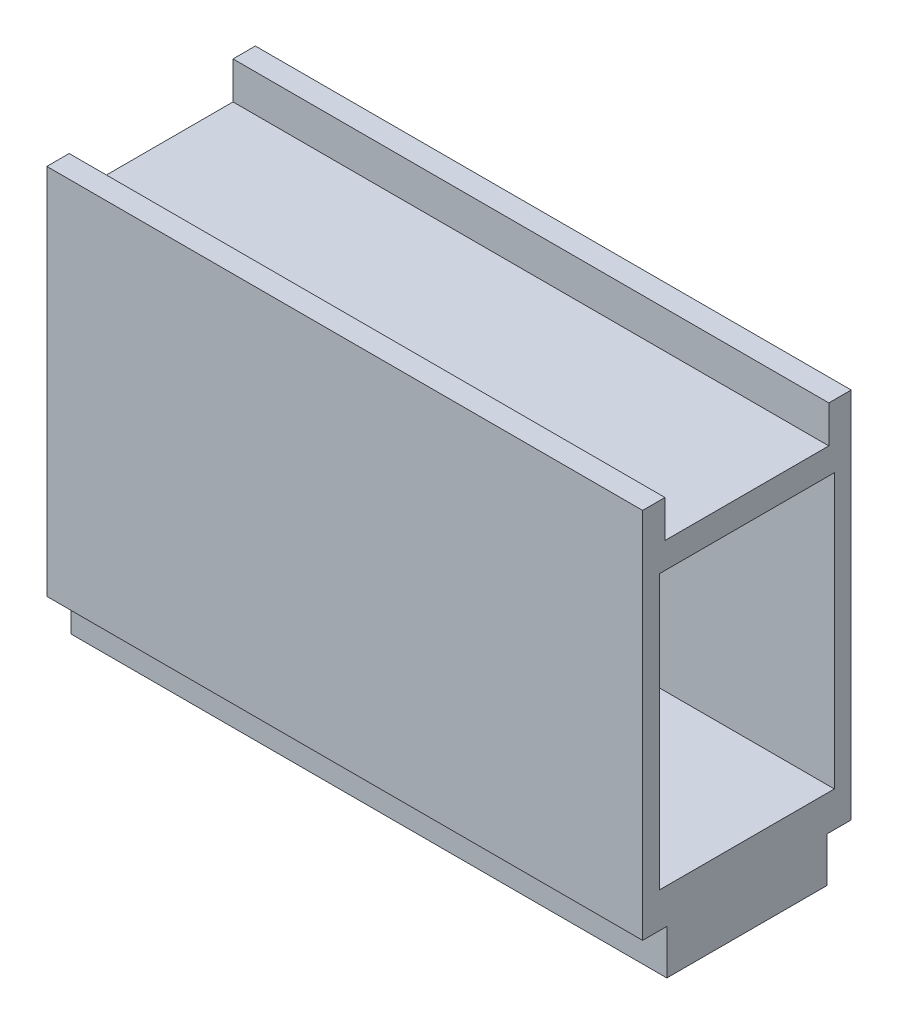
ISO-10303-21;
HEADER;
FILE_DESCRIPTION(('STEP AP214'),'2;1');
FILE_NAME('part.step','',(''),(''),'','','');
FILE_SCHEMA(('AUTOMOTIVE_DESIGN { 1 0 10303 214 1 1 1 1 }'));
ENDSEC;
DATA;
#1=APPLICATION_CONTEXT('core data for automotive mechanical design processes');
#2=APPLICATION_PROTOCOL_DEFINITION('international standard','automotive_design',2000,#1);
#3=PRODUCT_CONTEXT('',#1,'mechanical');
#4=PRODUCT('Part','Part','',(#3));
#5=PRODUCT_RELATED_PRODUCT_CATEGORY('part','',(#4));
#6=PRODUCT_DEFINITION_FORMATION('','',#4);
#7=PRODUCT_DEFINITION_CONTEXT('part definition',#1,'design');
#8=PRODUCT_DEFINITION('design','',#6,#7);
#9=PRODUCT_DEFINITION_SHAPE('','',#8);
#10=(LENGTH_UNIT() NAMED_UNIT(*) SI_UNIT(.MILLI.,.METRE.));
#11=(NAMED_UNIT(*) PLANE_ANGLE_UNIT() SI_UNIT($,.RADIAN.));
#12=(NAMED_UNIT(*) SI_UNIT($,.STERADIAN.) SOLID_ANGLE_UNIT());
#13=UNCERTAINTY_MEASURE_WITH_UNIT(LENGTH_MEASURE(1.E-05),#10,'distance_accuracy_value','');
#14=(GEOMETRIC_REPRESENTATION_CONTEXT(3) GLOBAL_UNCERTAINTY_ASSIGNED_CONTEXT((#13)) GLOBAL_UNIT_ASSIGNED_CONTEXT((#10,
#11,#12)) REPRESENTATION_CONTEXT('',''));
#15=CARTESIAN_POINT('',(0.,0.,0.));
#16=DIRECTION('',(0.,0.,1.));
#17=DIRECTION('',(1.,0.,0.));
#18=AXIS2_PLACEMENT_3D('',#15,#16,#17);
#19=CARTESIAN_POINT('',(0.,56.,0.));
#20=DIRECTION('',(0.,1.,0.));
#21=DIRECTION('',(0.,0.,1.));
#22=AXIS2_PLACEMENT_3D('',#19,#20,#21);
#23=PLANE('',#22);
#24=DIRECTION('',(-1.,0.,0.));
#25=VECTOR('',#24,1.);
#26=CARTESIAN_POINT('',(-40.,56.,-11.));
#27=LINE('',#26,#25);
#28=CARTESIAN_POINT('',(40.,56.,-11.));
#29=VERTEX_POINT('',#28);
#30=CARTESIAN_POINT('',(-40.,56.,-11.));
#31=VERTEX_POINT('',#30);
#32=EDGE_CURVE('E167',#29,#31,#27,.T.);
#33=ORIENTED_EDGE('',*,*,#32,.F.);
#34=DIRECTION('',(0.,0.,-1.));
#35=VECTOR('',#34,1.);
#36=CARTESIAN_POINT('',(40.,56.,-14.));
#37=LINE('',#36,#35);
#38=CARTESIAN_POINT('',(40.,56.,-14.));
#39=VERTEX_POINT('',#38);
#40=EDGE_CURVE('E220',#29,#39,#37,.T.);
#41=ORIENTED_EDGE('',*,*,#40,.T.);
#42=DIRECTION('',(-1.,0.,0.));
#43=VECTOR('',#42,1.);
#44=CARTESIAN_POINT('',(-40.,56.,-14.));
#45=LINE('',#44,#43);
#46=CARTESIAN_POINT('',(-40.,56.,-14.));
#47=VERTEX_POINT('',#46);
#48=EDGE_CURVE('E216',#39,#47,#45,.T.);
#49=ORIENTED_EDGE('',*,*,#48,.T.);
#50=DIRECTION('',(0.,0.,1.));
#51=VECTOR('',#50,1.);
#52=CARTESIAN_POINT('',(-40.,56.,-14.));
#53=LINE('',#52,#51);
#54=EDGE_CURVE('E219',#47,#31,#53,.T.);
#55=ORIENTED_EDGE('',*,*,#54,.T.);
#56=EDGE_LOOP('',(#33,#41,#49,#55));
#57=FACE_BOUND('',#56,.T.);
#58=ADVANCED_FACE('F39',(#57),#23,.T.);
#59=CARTESIAN_POINT('',(40.,6.,-10.75));
#60=DIRECTION('',(-1.,0.,0.));
#61=DIRECTION('',(0.,0.,1.));
#62=AXIS2_PLACEMENT_3D('',#59,#60,#61);
#63=PLANE('',#62);
#64=DIRECTION('',(0.,0.,1.));
#65=VECTOR('',#64,1.);
#66=CARTESIAN_POINT('',(40.,47.5127699022072,11.7433662398209));
#67=LINE('',#66,#65);
#68=CARTESIAN_POINT('',(40.,47.5127699022072,-11.7433662398209));
#69=VERTEX_POINT('',#68);
#70=CARTESIAN_POINT('',(40.,47.5127699022072,11.7433662398209));
#71=VERTEX_POINT('',#70);
#72=EDGE_CURVE('E171',#69,#71,#67,.T.);
#73=ORIENTED_EDGE('',*,*,#72,.F.);
#74=DIRECTION('',(0.,1.,0.));
#75=VECTOR('',#74,1.);
#76=CARTESIAN_POINT('',(40.,47.5127699022072,-11.7433662398209));
#77=LINE('',#76,#75);
#78=CARTESIAN_POINT('',(40.,10.7374914143469,-11.7433662398209));
#79=VERTEX_POINT('',#78);
#80=EDGE_CURVE('E53',#79,#69,#77,.T.);
#81=ORIENTED_EDGE('',*,*,#80,.F.);
#82=DIRECTION('',(0.,0.,-1.));
#83=VECTOR('',#82,1.);
#84=CARTESIAN_POINT('',(40.,10.7374914143469,11.7433662398209));
#85=LINE('',#84,#83);
#86=CARTESIAN_POINT('',(40.,10.7374914143469,11.7433662398209));
#87=VERTEX_POINT('',#86);
#88=EDGE_CURVE('E159',#87,#79,#85,.T.);
#89=ORIENTED_EDGE('',*,*,#88,.F.);
#90=DIRECTION('',(0.,-1.,0.));
#91=VECTOR('',#90,1.);
#92=CARTESIAN_POINT('',(40.,47.5127699022072,11.7433662398209));
#93=LINE('',#92,#91);
#94=EDGE_CURVE('E176',#71,#87,#93,.T.);
#95=ORIENTED_EDGE('',*,*,#94,.F.);
#96=EDGE_LOOP('',(#73,#81,#89,#95));
#97=FACE_BOUND('',#96,.T.);
#98=DIRECTION('',(0.,0.,-1.));
#99=VECTOR('',#98,1.);
#100=CARTESIAN_POINT('',(40.,51.,-11.));
#101=LINE('',#100,#99);
#102=CARTESIAN_POINT('',(40.,51.,11.));
#103=VERTEX_POINT('',#102);
#104=CARTESIAN_POINT('',(40.,51.,-11.));
#105=VERTEX_POINT('',#104);
#106=EDGE_CURVE('E186',#103,#105,#101,.T.);
#107=ORIENTED_EDGE('',*,*,#106,.F.);
#108=DIRECTION('',(0.,1.,0.));
#109=VECTOR('',#108,1.);
#110=CARTESIAN_POINT('',(40.,51.,11.));
#111=LINE('',#110,#109);
#112=CARTESIAN_POINT('',(40.,56.,11.));
#113=VERTEX_POINT('',#112);
#114=EDGE_CURVE('E201',#103,#113,#111,.T.);
#115=ORIENTED_EDGE('',*,*,#114,.T.);
#116=CARTESIAN_POINT('',(40.,56.,14.));
#117=VERTEX_POINT('',#116);
#118=EDGE_CURVE('E213',#117,#113,#37,.T.);
#119=ORIENTED_EDGE('',*,*,#118,.F.);
#120=DIRECTION('',(0.,-1.,0.));
#121=VECTOR('',#120,1.);
#122=CARTESIAN_POINT('',(40.,56.,14.));
#123=LINE('',#122,#121);
#124=CARTESIAN_POINT('',(40.,6.,14.));
#125=VERTEX_POINT('',#124);
#126=EDGE_CURVE('E223',#117,#125,#123,.T.);
#127=ORIENTED_EDGE('',*,*,#126,.T.);
#128=DIRECTION('',(0.,0.,-1.));
#129=VECTOR('',#128,1.);
#130=CARTESIAN_POINT('',(40.,6.,-14.));
#131=LINE('',#130,#129);
#132=CARTESIAN_POINT('',(40.,6.,10.75));
#133=VERTEX_POINT('',#132);
#134=EDGE_CURVE('E227',#125,#133,#131,.T.);
#135=ORIENTED_EDGE('',*,*,#134,.T.);
#136=DIRECTION('',(0.,-1.,0.));
#137=VECTOR('',#136,1.);
#138=CARTESIAN_POINT('',(40.,6.,10.75));
#139=LINE('',#138,#137);
#140=CARTESIAN_POINT('',(40.,0.,10.75));
#141=VERTEX_POINT('',#140);
#142=EDGE_CURVE('E258',#133,#141,#139,.T.);
#143=ORIENTED_EDGE('',*,*,#142,.T.);
#144=DIRECTION('',(0.,0.,-1.));
#145=VECTOR('',#144,1.);
#146=CARTESIAN_POINT('',(40.,0.,-10.75));
#147=LINE('',#146,#145);
#148=CARTESIAN_POINT('',(40.,0.,-10.75));
#149=VERTEX_POINT('',#148);
#150=EDGE_CURVE('E247',#141,#149,#147,.T.);
#151=ORIENTED_EDGE('',*,*,#150,.T.);
#152=DIRECTION('',(0.,-1.,0.));
#153=VECTOR('',#152,1.);
#154=CARTESIAN_POINT('',(40.,6.,-10.75));
#155=LINE('',#154,#153);
#156=CARTESIAN_POINT('',(40.,6.,-10.75));
#157=VERTEX_POINT('',#156);
#158=EDGE_CURVE('E11',#157,#149,#155,.T.);
#159=ORIENTED_EDGE('',*,*,#158,.F.);
#160=CARTESIAN_POINT('',(40.,6.,-14.));
#161=VERTEX_POINT('',#160);
#162=EDGE_CURVE('E206',#157,#161,#131,.T.);
#163=ORIENTED_EDGE('',*,*,#162,.T.);
#164=DIRECTION('',(0.,-1.,0.));
#165=VECTOR('',#164,1.);
#166=CARTESIAN_POINT('',(40.,56.,-14.));
#167=LINE('',#166,#165);
#168=EDGE_CURVE('E243',#39,#161,#167,.T.);
#169=ORIENTED_EDGE('',*,*,#168,.F.);
#170=ORIENTED_EDGE('',*,*,#40,.F.);
#171=DIRECTION('',(0.,1.,0.));
#172=VECTOR('',#171,1.);
#173=CARTESIAN_POINT('',(40.,51.,-11.));
#174=LINE('',#173,#172);
#175=EDGE_CURVE('E199',#105,#29,#174,.T.);
#176=ORIENTED_EDGE('',*,*,#175,.F.);
#177=EDGE_LOOP('',(#107,#115,#119,#127,#135,#143,#151,#159,#163,#169,#170,#176));
#178=FACE_BOUND('',#177,.T.);
#179=ADVANCED_FACE('F41',(#97,#178),#63,.F.);
#180=CARTESIAN_POINT('',(-40.,6.,-10.75));
#181=DIRECTION('',(0.,0.,1.));
#182=DIRECTION('',(1.,0.,0.));
#183=AXIS2_PLACEMENT_3D('',#180,#181,#182);
#184=PLANE('',#183);
#185=DIRECTION('',(-1.,0.,0.));
#186=VECTOR('',#185,1.);
#187=CARTESIAN_POINT('',(-40.,0.,-10.75));
#188=LINE('',#187,#186);
#189=CARTESIAN_POINT('',(-40.,0.,-10.75));
#190=VERTEX_POINT('',#189);
#191=EDGE_CURVE('E259',#149,#190,#188,.T.);
#192=ORIENTED_EDGE('',*,*,#191,.T.);
#193=DIRECTION('',(0.,-1.,0.));
#194=VECTOR('',#193,1.);
#195=CARTESIAN_POINT('',(-40.,6.,-10.75));
#196=LINE('',#195,#194);
#197=CARTESIAN_POINT('',(-40.,6.,-10.75));
#198=VERTEX_POINT('',#197);
#199=EDGE_CURVE('E50',#198,#190,#196,.T.);
#200=ORIENTED_EDGE('',*,*,#199,.F.);
#201=DIRECTION('',(-1.,0.,0.));
#202=VECTOR('',#201,1.);
#203=CARTESIAN_POINT('',(-40.,6.,-10.75));
#204=LINE('',#203,#202);
#205=EDGE_CURVE('E250',#157,#198,#204,.T.);
#206=ORIENTED_EDGE('',*,*,#205,.F.);
#207=ORIENTED_EDGE('',*,*,#158,.T.);
#208=EDGE_LOOP('',(#192,#200,#206,#207));
#209=FACE_BOUND('',#208,.T.);
#210=ADVANCED_FACE('F319',(#209),#184,.F.);
#211=CARTESIAN_POINT('',(-40.,6.,-10.75));
#212=DIRECTION('',(1.,0.,0.));
#213=DIRECTION('',(0.,0.,-1.));
#214=AXIS2_PLACEMENT_3D('',#211,#212,#213);
#215=PLANE('',#214);
#216=DIRECTION('',(0.,0.,1.));
#217=VECTOR('',#216,1.);
#218=CARTESIAN_POINT('',(-40.,10.7374914143469,11.7433662398209));
#219=LINE('',#218,#217);
#220=CARTESIAN_POINT('',(-40.,10.7374914143469,-11.7433662398209));
#221=VERTEX_POINT('',#220);
#222=CARTESIAN_POINT('',(-40.,10.7374914143469,11.7433662398209));
#223=VERTEX_POINT('',#222);
#224=EDGE_CURVE('E175',#221,#223,#219,.T.);
#225=ORIENTED_EDGE('',*,*,#224,.F.);
#226=DIRECTION('',(0.,-1.,0.));
#227=VECTOR('',#226,1.);
#228=CARTESIAN_POINT('',(-40.,47.5127699022072,-11.7433662398209));
#229=LINE('',#228,#227);
#230=CARTESIAN_POINT('',(-40.,47.5127699022072,-11.7433662398209));
#231=VERTEX_POINT('',#230);
#232=EDGE_CURVE('E152',#231,#221,#229,.T.);
#233=ORIENTED_EDGE('',*,*,#232,.F.);
#234=DIRECTION('',(0.,0.,-1.));
#235=VECTOR('',#234,1.);
#236=CARTESIAN_POINT('',(-40.,47.5127699022072,11.7433662398209));
#237=LINE('',#236,#235);
#238=CARTESIAN_POINT('',(-40.,47.5127699022072,11.7433662398209));
#239=VERTEX_POINT('',#238);
#240=EDGE_CURVE('E162',#239,#231,#237,.T.);
#241=ORIENTED_EDGE('',*,*,#240,.F.);
#242=DIRECTION('',(0.,1.,0.));
#243=VECTOR('',#242,1.);
#244=CARTESIAN_POINT('',(-40.,47.5127699022072,11.7433662398209));
#245=LINE('',#244,#243);
#246=EDGE_CURVE('E65',#223,#239,#245,.T.);
#247=ORIENTED_EDGE('',*,*,#246,.F.);
#248=EDGE_LOOP('',(#225,#233,#241,#247));
#249=FACE_BOUND('',#248,.T.);
#250=DIRECTION('',(0.,0.,1.));
#251=VECTOR('',#250,1.);
#252=CARTESIAN_POINT('',(-40.,51.,-11.));
#253=LINE('',#252,#251);
#254=CARTESIAN_POINT('',(-40.,51.,-11.));
#255=VERTEX_POINT('',#254);
#256=CARTESIAN_POINT('',(-40.,51.,11.));
#257=VERTEX_POINT('',#256);
#258=EDGE_CURVE('E191',#255,#257,#253,.T.);
#259=ORIENTED_EDGE('',*,*,#258,.F.);
#260=DIRECTION('',(0.,1.,0.));
#261=VECTOR('',#260,1.);
#262=CARTESIAN_POINT('',(-40.,51.,-11.));
#263=LINE('',#262,#261);
#264=EDGE_CURVE('E207',#255,#31,#263,.T.);
#265=ORIENTED_EDGE('',*,*,#264,.T.);
#266=ORIENTED_EDGE('',*,*,#54,.F.);
#267=DIRECTION('',(0.,-1.,0.));
#268=VECTOR('',#267,1.);
#269=CARTESIAN_POINT('',(-40.,56.,-14.));
#270=LINE('',#269,#268);
#271=CARTESIAN_POINT('',(-40.,6.,-14.));
#272=VERTEX_POINT('',#271);
#273=EDGE_CURVE('E245',#47,#272,#270,.T.);
#274=ORIENTED_EDGE('',*,*,#273,.T.);
#275=DIRECTION('',(0.,0.,1.));
#276=VECTOR('',#275,1.);
#277=CARTESIAN_POINT('',(-40.,6.,-14.));
#278=LINE('',#277,#276);
#279=EDGE_CURVE('E234',#272,#198,#278,.T.);
#280=ORIENTED_EDGE('',*,*,#279,.T.);
#281=ORIENTED_EDGE('',*,*,#199,.T.);
#282=DIRECTION('',(0.,0.,1.));
#283=VECTOR('',#282,1.);
#284=CARTESIAN_POINT('',(-40.,0.,-10.75));
#285=LINE('',#284,#283);
#286=CARTESIAN_POINT('',(-40.,0.,10.75));
#287=VERTEX_POINT('',#286);
#288=EDGE_CURVE('E261',#190,#287,#285,.T.);
#289=ORIENTED_EDGE('',*,*,#288,.T.);
#290=DIRECTION('',(0.,-1.,0.));
#291=VECTOR('',#290,1.);
#292=CARTESIAN_POINT('',(-40.,6.,10.75));
#293=LINE('',#292,#291);
#294=CARTESIAN_POINT('',(-40.,6.,10.75));
#295=VERTEX_POINT('',#294);
#296=EDGE_CURVE('E266',#295,#287,#293,.T.);
#297=ORIENTED_EDGE('',*,*,#296,.F.);
#298=CARTESIAN_POINT('',(-40.,6.,14.));
#299=VERTEX_POINT('',#298);
#300=EDGE_CURVE('E233',#295,#299,#278,.T.);
#301=ORIENTED_EDGE('',*,*,#300,.T.);
#302=DIRECTION('',(0.,-1.,0.));
#303=VECTOR('',#302,1.);
#304=CARTESIAN_POINT('',(-40.,56.,14.));
#305=LINE('',#304,#303);
#306=CARTESIAN_POINT('',(-40.,56.,14.));
#307=VERTEX_POINT('',#306);
#308=EDGE_CURVE('E239',#307,#299,#305,.T.);
#309=ORIENTED_EDGE('',*,*,#308,.F.);
#310=CARTESIAN_POINT('',(-40.,56.,11.));
#311=VERTEX_POINT('',#310);
#312=EDGE_CURVE('E218',#311,#307,#53,.T.);
#313=ORIENTED_EDGE('',*,*,#312,.F.);
#314=DIRECTION('',(0.,1.,0.));
#315=VECTOR('',#314,1.);
#316=CARTESIAN_POINT('',(-40.,51.,11.));
#317=LINE('',#316,#315);
#318=EDGE_CURVE('E210',#257,#311,#317,.T.);
#319=ORIENTED_EDGE('',*,*,#318,.F.);
#320=EDGE_LOOP('',(#259,#265,#266,#274,#280,#281,#289,#297,#301,#309,#313,#319));
#321=FACE_BOUND('',#320,.T.);
#322=ADVANCED_FACE('F166',(#249,#321),#215,.F.);
#323=CARTESIAN_POINT('',(-40.,6.,10.75));
#324=DIRECTION('',(0.,0.,-1.));
#325=DIRECTION('',(-1.,0.,0.));
#326=AXIS2_PLACEMENT_3D('',#323,#324,#325);
#327=PLANE('',#326);
#328=DIRECTION('',(1.,0.,0.));
#329=VECTOR('',#328,1.);
#330=CARTESIAN_POINT('',(-40.,0.,10.75));
#331=LINE('',#330,#329);
#332=EDGE_CURVE('E251',#287,#141,#331,.T.);
#333=ORIENTED_EDGE('',*,*,#332,.T.);
#334=ORIENTED_EDGE('',*,*,#142,.F.);
#335=DIRECTION('',(1.,0.,0.));
#336=VECTOR('',#335,1.);
#337=CARTESIAN_POINT('',(-40.,6.,10.75));
#338=LINE('',#337,#336);
#339=EDGE_CURVE('E252',#295,#133,#338,.T.);
#340=ORIENTED_EDGE('',*,*,#339,.F.);
#341=ORIENTED_EDGE('',*,*,#296,.T.);
#342=EDGE_LOOP('',(#333,#334,#340,#341));
#343=FACE_BOUND('',#342,.T.);
#344=ADVANCED_FACE('F279',(#343),#327,.F.);
#345=CARTESIAN_POINT('',(0.,0.,0.));
#346=DIRECTION('',(0.,1.,0.));
#347=DIRECTION('',(0.,0.,1.));
#348=AXIS2_PLACEMENT_3D('',#345,#346,#347);
#349=PLANE('',#348);
#350=ORIENTED_EDGE('',*,*,#150,.F.);
#351=ORIENTED_EDGE('',*,*,#332,.F.);
#352=ORIENTED_EDGE('',*,*,#288,.F.);
#353=ORIENTED_EDGE('',*,*,#191,.F.);
#354=EDGE_LOOP('',(#350,#351,#352,#353));
#355=FACE_BOUND('',#354,.T.);
#356=ADVANCED_FACE('F277',(#355),#349,.F.);
#357=CARTESIAN_POINT('',(0.,6.,0.));
#358=DIRECTION('',(0.,1.,0.));
#359=DIRECTION('',(0.,0.,1.));
#360=AXIS2_PLACEMENT_3D('',#357,#358,#359);
#361=PLANE('',#360);
#362=ORIENTED_EDGE('',*,*,#162,.F.);
#363=ORIENTED_EDGE('',*,*,#205,.T.);
#364=ORIENTED_EDGE('',*,*,#279,.F.);
#365=DIRECTION('',(-1.,0.,0.));
#366=VECTOR('',#365,1.);
#367=CARTESIAN_POINT('',(-40.,6.,-14.));
#368=LINE('',#367,#366);
#369=EDGE_CURVE('E226',#161,#272,#368,.T.);
#370=ORIENTED_EDGE('',*,*,#369,.F.);
#371=EDGE_LOOP('',(#362,#363,#364,#370));
#372=FACE_BOUND('',#371,.T.);
#373=ADVANCED_FACE('F317',(#372),#361,.F.);
#374=ORIENTED_EDGE('',*,*,#300,.F.);
#375=ORIENTED_EDGE('',*,*,#339,.T.);
#376=ORIENTED_EDGE('',*,*,#134,.F.);
#377=DIRECTION('',(1.,0.,0.));
#378=VECTOR('',#377,1.);
#379=CARTESIAN_POINT('',(-40.,6.,14.));
#380=LINE('',#379,#378);
#381=EDGE_CURVE('E231',#299,#125,#380,.T.);
#382=ORIENTED_EDGE('',*,*,#381,.F.);
#383=EDGE_LOOP('',(#374,#375,#376,#382));
#384=FACE_BOUND('',#383,.T.);
#385=ADVANCED_FACE('F290',(#384),#361,.F.);
#386=CARTESIAN_POINT('',(-40.,56.,-14.));
#387=DIRECTION('',(0.,0.,1.));
#388=DIRECTION('',(1.,0.,0.));
#389=AXIS2_PLACEMENT_3D('',#386,#387,#388);
#390=PLANE('',#389);
#391=ORIENTED_EDGE('',*,*,#369,.T.);
#392=ORIENTED_EDGE('',*,*,#273,.F.);
#393=ORIENTED_EDGE('',*,*,#48,.F.);
#394=ORIENTED_EDGE('',*,*,#168,.T.);
#395=EDGE_LOOP('',(#391,#392,#393,#394));
#396=FACE_BOUND('',#395,.T.);
#397=ADVANCED_FACE('F321',(#396),#390,.F.);
#398=CARTESIAN_POINT('',(-40.,56.,14.));
#399=DIRECTION('',(0.,0.,-1.));
#400=DIRECTION('',(-1.,0.,0.));
#401=AXIS2_PLACEMENT_3D('',#398,#399,#400);
#402=PLANE('',#401);
#403=ORIENTED_EDGE('',*,*,#381,.T.);
#404=ORIENTED_EDGE('',*,*,#126,.F.);
#405=DIRECTION('',(1.,0.,0.));
#406=VECTOR('',#405,1.);
#407=CARTESIAN_POINT('',(-40.,56.,14.));
#408=LINE('',#407,#406);
#409=EDGE_CURVE('E224',#307,#117,#408,.T.);
#410=ORIENTED_EDGE('',*,*,#409,.F.);
#411=ORIENTED_EDGE('',*,*,#308,.T.);
#412=EDGE_LOOP('',(#403,#404,#410,#411));
#413=FACE_BOUND('',#412,.T.);
#414=ADVANCED_FACE('F294',(#413),#402,.F.);
#415=DIRECTION('',(1.,0.,0.));
#416=VECTOR('',#415,1.);
#417=CARTESIAN_POINT('',(-40.,56.,11.));
#418=LINE('',#417,#416);
#419=EDGE_CURVE('E192',#311,#113,#418,.T.);
#420=ORIENTED_EDGE('',*,*,#419,.F.);
#421=ORIENTED_EDGE('',*,*,#312,.T.);
#422=ORIENTED_EDGE('',*,*,#409,.T.);
#423=ORIENTED_EDGE('',*,*,#118,.T.);
#424=EDGE_LOOP('',(#420,#421,#422,#423));
#425=FACE_BOUND('',#424,.T.);
#426=ADVANCED_FACE('F300',(#425),#23,.T.);
#427=CARTESIAN_POINT('',(-40.,51.,11.));
#428=DIRECTION('',(0.,0.,1.));
#429=DIRECTION('',(1.,0.,0.));
#430=AXIS2_PLACEMENT_3D('',#427,#428,#429);
#431=PLANE('',#430);
#432=ORIENTED_EDGE('',*,*,#419,.T.);
#433=ORIENTED_EDGE('',*,*,#114,.F.);
#434=DIRECTION('',(1.,0.,0.));
#435=VECTOR('',#434,1.);
#436=CARTESIAN_POINT('',(-40.,51.,11.));
#437=LINE('',#436,#435);
#438=EDGE_CURVE('E197',#257,#103,#437,.T.);
#439=ORIENTED_EDGE('',*,*,#438,.F.);
#440=ORIENTED_EDGE('',*,*,#318,.T.);
#441=EDGE_LOOP('',(#432,#433,#439,#440));
#442=FACE_BOUND('',#441,.T.);
#443=ADVANCED_FACE('F303',(#442),#431,.F.);
#444=CARTESIAN_POINT('',(-40.,51.,-11.));
#445=DIRECTION('',(0.,0.,-1.));
#446=DIRECTION('',(-1.,0.,0.));
#447=AXIS2_PLACEMENT_3D('',#444,#445,#446);
#448=PLANE('',#447);
#449=ORIENTED_EDGE('',*,*,#32,.T.);
#450=ORIENTED_EDGE('',*,*,#264,.F.);
#451=DIRECTION('',(-1.,0.,0.));
#452=VECTOR('',#451,1.);
#453=CARTESIAN_POINT('',(-40.,51.,-11.));
#454=LINE('',#453,#452);
#455=EDGE_CURVE('E194',#105,#255,#454,.T.);
#456=ORIENTED_EDGE('',*,*,#455,.F.);
#457=ORIENTED_EDGE('',*,*,#175,.T.);
#458=EDGE_LOOP('',(#449,#450,#456,#457));
#459=FACE_BOUND('',#458,.T.);
#460=ADVANCED_FACE('F310',(#459),#448,.F.);
#461=CARTESIAN_POINT('',(0.,51.,0.));
#462=DIRECTION('',(0.,1.,0.));
#463=DIRECTION('',(0.,0.,1.));
#464=AXIS2_PLACEMENT_3D('',#461,#462,#463);
#465=PLANE('',#464);
#466=ORIENTED_EDGE('',*,*,#106,.T.);
#467=ORIENTED_EDGE('',*,*,#455,.T.);
#468=ORIENTED_EDGE('',*,*,#258,.T.);
#469=ORIENTED_EDGE('',*,*,#438,.T.);
#470=EDGE_LOOP('',(#466,#467,#468,#469));
#471=FACE_BOUND('',#470,.T.);
#472=ADVANCED_FACE('F302',(#471),#465,.T.);
#473=CARTESIAN_POINT('',(-40.001,47.5127699022072,-11.7433662398209));
#474=DIRECTION('',(0.,0.,-1.));
#475=DIRECTION('',(-1.,0.,0.));
#476=AXIS2_PLACEMENT_3D('',#473,#474,#475);
#477=PLANE('',#476);
#478=ORIENTED_EDGE('',*,*,#232,.T.);
#479=DIRECTION('',(1.,0.,0.));
#480=VECTOR('',#479,1.);
#481=CARTESIAN_POINT('',(-40.001,10.7374914143469,-11.7433662398209));
#482=LINE('',#481,#480);
#483=EDGE_CURVE('E170',#221,#79,#482,.T.);
#484=ORIENTED_EDGE('',*,*,#483,.T.);
#485=ORIENTED_EDGE('',*,*,#80,.T.);
#486=DIRECTION('',(1.,0.,0.));
#487=VECTOR('',#486,1.);
#488=CARTESIAN_POINT('',(-40.001,47.5127699022072,-11.7433662398209));
#489=LINE('',#488,#487);
#490=EDGE_CURVE('E147',#231,#69,#489,.T.);
#491=ORIENTED_EDGE('',*,*,#490,.F.);
#492=EDGE_LOOP('',(#478,#484,#485,#491));
#493=FACE_BOUND('',#492,.T.);
#494=ADVANCED_FACE('F155',(#493),#477,.F.);
#495=CARTESIAN_POINT('',(-40.001,10.7374914143469,11.7433662398209));
#496=DIRECTION('',(0.,-1.,0.));
#497=DIRECTION('',(0.,0.,-1.));
#498=AXIS2_PLACEMENT_3D('',#495,#496,#497);
#499=PLANE('',#498);
#500=ORIENTED_EDGE('',*,*,#224,.T.);
#501=DIRECTION('',(1.,0.,0.));
#502=VECTOR('',#501,1.);
#503=CARTESIAN_POINT('',(-40.001,10.7374914143469,11.7433662398209));
#504=LINE('',#503,#502);
#505=EDGE_CURVE('E187',#223,#87,#504,.T.);
#506=ORIENTED_EDGE('',*,*,#505,.T.);
#507=ORIENTED_EDGE('',*,*,#88,.T.);
#508=ORIENTED_EDGE('',*,*,#483,.F.);
#509=EDGE_LOOP('',(#500,#506,#507,#508));
#510=FACE_BOUND('',#509,.T.);
#511=ADVANCED_FACE('F352',(#510),#499,.F.);
#512=CARTESIAN_POINT('',(-40.001,47.5127699022072,11.7433662398209));
#513=DIRECTION('',(0.,0.,1.));
#514=DIRECTION('',(1.,0.,0.));
#515=AXIS2_PLACEMENT_3D('',#512,#513,#514);
#516=PLANE('',#515);
#517=ORIENTED_EDGE('',*,*,#246,.T.);
#518=DIRECTION('',(1.,0.,0.));
#519=VECTOR('',#518,1.);
#520=CARTESIAN_POINT('',(-40.001,47.5127699022072,11.7433662398209));
#521=LINE('',#520,#519);
#522=EDGE_CURVE('E157',#239,#71,#521,.T.);
#523=ORIENTED_EDGE('',*,*,#522,.T.);
#524=ORIENTED_EDGE('',*,*,#94,.T.);
#525=ORIENTED_EDGE('',*,*,#505,.F.);
#526=EDGE_LOOP('',(#517,#523,#524,#525));
#527=FACE_BOUND('',#526,.T.);
#528=ADVANCED_FACE('F351',(#527),#516,.F.);
#529=CARTESIAN_POINT('',(-40.001,47.5127699022072,11.7433662398209));
#530=DIRECTION('',(0.,1.,0.));
#531=DIRECTION('',(0.,0.,1.));
#532=AXIS2_PLACEMENT_3D('',#529,#530,#531);
#533=PLANE('',#532);
#534=ORIENTED_EDGE('',*,*,#240,.T.);
#535=ORIENTED_EDGE('',*,*,#490,.T.);
#536=ORIENTED_EDGE('',*,*,#72,.T.);
#537=ORIENTED_EDGE('',*,*,#522,.F.);
#538=EDGE_LOOP('',(#534,#535,#536,#537));
#539=FACE_BOUND('',#538,.T.);
#540=ADVANCED_FACE('F163',(#539),#533,.F.);
#541=CLOSED_SHELL('',(#58,#179,#210,#322,#344,#356,#373,#385,#397,#414,#426,#443,#460,#472,#494,
#511,#528,#540));
#542=MANIFOLD_SOLID_BREP('B2',#541);
#543=ADVANCED_BREP_SHAPE_REPRESENTATION('',(#18,#542),#14);
#544=SHAPE_DEFINITION_REPRESENTATION(#9,#543);
ENDSEC;
END-ISO-10303-21;
